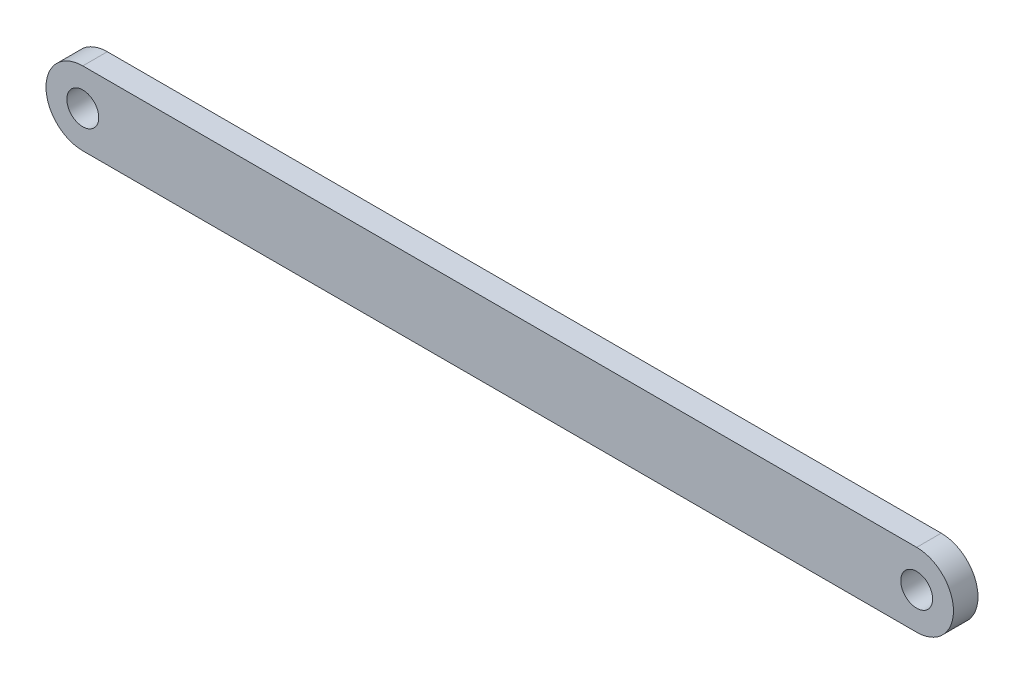
ISO-10303-21;
HEADER;
FILE_DESCRIPTION(('STEP AP214'),'2;1');
FILE_NAME('part.step','',(''),(''),'','','');
FILE_SCHEMA(('AUTOMOTIVE_DESIGN { 1 0 10303 214 1 1 1 1 }'));
ENDSEC;
DATA;
#1=APPLICATION_CONTEXT('core data for automotive mechanical design processes');
#2=APPLICATION_PROTOCOL_DEFINITION('international standard','automotive_design',2000,#1);
#3=PRODUCT_CONTEXT('',#1,'mechanical');
#4=PRODUCT('Part','Part','',(#3));
#5=PRODUCT_RELATED_PRODUCT_CATEGORY('part','',(#4));
#6=PRODUCT_DEFINITION_FORMATION('','',#4);
#7=PRODUCT_DEFINITION_CONTEXT('part definition',#1,'design');
#8=PRODUCT_DEFINITION('design','',#6,#7);
#9=PRODUCT_DEFINITION_SHAPE('','',#8);
#10=(LENGTH_UNIT() NAMED_UNIT(*) SI_UNIT(.MILLI.,.METRE.));
#11=(NAMED_UNIT(*) PLANE_ANGLE_UNIT() SI_UNIT($,.RADIAN.));
#12=(NAMED_UNIT(*) SI_UNIT($,.STERADIAN.) SOLID_ANGLE_UNIT());
#13=UNCERTAINTY_MEASURE_WITH_UNIT(LENGTH_MEASURE(1.E-05),#10,'distance_accuracy_value','');
#14=(GEOMETRIC_REPRESENTATION_CONTEXT(3) GLOBAL_UNCERTAINTY_ASSIGNED_CONTEXT((#13)) GLOBAL_UNIT_ASSIGNED_CONTEXT((#10,
#11,#12)) REPRESENTATION_CONTEXT('',''));
#15=CARTESIAN_POINT('',(0.,0.,0.));
#16=DIRECTION('',(0.,0.,1.));
#17=DIRECTION('',(1.,0.,0.));
#18=AXIS2_PLACEMENT_3D('',#15,#16,#17);
#19=CARTESIAN_POINT('',(0.,0.,2.5));
#20=DIRECTION('',(0.,0.,1.));
#21=DIRECTION('',(1.,0.,0.));
#22=AXIS2_PLACEMENT_3D('',#19,#20,#21);
#23=PLANE('',#22);
#24=CARTESIAN_POINT('',(0.,0.,2.5));
#25=DIRECTION('',(0.,0.,1.));
#26=DIRECTION('',(1.,0.,0.));
#27=AXIS2_PLACEMENT_3D('',#24,#25,#26);
#28=CIRCLE('',#27,3.25);
#29=CARTESIAN_POINT('',(3.25,0.,2.5));
#30=VERTEX_POINT('',#29);
#31=EDGE_CURVE('E102',#30,#30,#28,.T.);
#32=ORIENTED_EDGE('',*,*,#31,.F.);
#33=EDGE_LOOP('',(#32));
#34=FACE_BOUND('',#33,.T.);
#35=CARTESIAN_POINT('',(0.,0.,2.5));
#36=DIRECTION('',(0.,0.,1.));
#37=DIRECTION('',(1.,0.,0.));
#38=AXIS2_PLACEMENT_3D('',#35,#36,#37);
#39=CIRCLE('',#38,7.5);
#40=CARTESIAN_POINT('',(0.,7.5,2.5));
#41=VERTEX_POINT('',#40);
#42=CARTESIAN_POINT('',(0.,-7.5,2.5));
#43=VERTEX_POINT('',#42);
#44=EDGE_CURVE('E87',#41,#43,#39,.T.);
#45=ORIENTED_EDGE('',*,*,#44,.T.);
#46=DIRECTION('',(1.,0.,0.));
#47=VECTOR('',#46,1.);
#48=CARTESIAN_POINT('',(0.,-7.5,2.5));
#49=LINE('',#48,#47);
#50=CARTESIAN_POINT('',(170.,-7.5,2.5));
#51=VERTEX_POINT('',#50);
#52=EDGE_CURVE('E82',#43,#51,#49,.T.);
#53=ORIENTED_EDGE('',*,*,#52,.T.);
#54=CARTESIAN_POINT('',(170.,0.,2.5));
#55=DIRECTION('',(0.,0.,1.));
#56=DIRECTION('',(1.,0.,0.));
#57=AXIS2_PLACEMENT_3D('',#54,#55,#56);
#58=CIRCLE('',#57,7.5);
#59=CARTESIAN_POINT('',(170.,7.5,2.5));
#60=VERTEX_POINT('',#59);
#61=EDGE_CURVE('E85',#51,#60,#58,.T.);
#62=ORIENTED_EDGE('',*,*,#61,.T.);
#63=DIRECTION('',(-1.,0.,0.));
#64=VECTOR('',#63,1.);
#65=CARTESIAN_POINT('',(0.,7.5,2.5));
#66=LINE('',#65,#64);
#67=EDGE_CURVE('E52',#60,#41,#66,.T.);
#68=ORIENTED_EDGE('',*,*,#67,.T.);
#69=EDGE_LOOP('',(#45,#53,#62,#68));
#70=FACE_BOUND('',#69,.T.);
#71=CARTESIAN_POINT('',(170.,0.,2.5));
#72=DIRECTION('',(0.,0.,1.));
#73=DIRECTION('',(1.,0.,0.));
#74=AXIS2_PLACEMENT_3D('',#71,#72,#73);
#75=CIRCLE('',#74,3.25000000000001);
#76=CARTESIAN_POINT('',(173.25,0.,2.5));
#77=VERTEX_POINT('',#76);
#78=EDGE_CURVE('E117',#77,#77,#75,.T.);
#79=ORIENTED_EDGE('',*,*,#78,.F.);
#80=EDGE_LOOP('',(#79));
#81=FACE_BOUND('',#80,.T.);
#82=ADVANCED_FACE('F35',(#34,#70,#81),#23,.T.);
#83=CARTESIAN_POINT('',(0.,0.,-2.5));
#84=DIRECTION('',(0.,0.,1.));
#85=DIRECTION('',(1.,0.,0.));
#86=AXIS2_PLACEMENT_3D('',#83,#84,#85);
#87=PLANE('',#86);
#88=CARTESIAN_POINT('',(0.,0.,-2.5));
#89=DIRECTION('',(0.,0.,1.));
#90=DIRECTION('',(1.,0.,0.));
#91=AXIS2_PLACEMENT_3D('',#88,#89,#90);
#92=CIRCLE('',#91,3.25);
#93=CARTESIAN_POINT('',(3.25,0.,-2.5));
#94=VERTEX_POINT('',#93);
#95=EDGE_CURVE('E114',#94,#94,#92,.T.);
#96=ORIENTED_EDGE('',*,*,#95,.T.);
#97=EDGE_LOOP('',(#96));
#98=FACE_BOUND('',#97,.T.);
#99=CARTESIAN_POINT('',(0.,0.,-2.5));
#100=DIRECTION('',(0.,0.,1.));
#101=DIRECTION('',(1.,0.,0.));
#102=AXIS2_PLACEMENT_3D('',#99,#100,#101);
#103=CIRCLE('',#102,7.5);
#104=CARTESIAN_POINT('',(0.,7.5,-2.5));
#105=VERTEX_POINT('',#104);
#106=CARTESIAN_POINT('',(0.,-7.5,-2.5));
#107=VERTEX_POINT('',#106);
#108=EDGE_CURVE('E99',#105,#107,#103,.T.);
#109=ORIENTED_EDGE('',*,*,#108,.F.);
#110=DIRECTION('',(-1.,0.,0.));
#111=VECTOR('',#110,1.);
#112=CARTESIAN_POINT('',(0.,7.5,-2.5));
#113=LINE('',#112,#111);
#114=CARTESIAN_POINT('',(170.,7.5,-2.5));
#115=VERTEX_POINT('',#114);
#116=EDGE_CURVE('E75',#115,#105,#113,.T.);
#117=ORIENTED_EDGE('',*,*,#116,.F.);
#118=CARTESIAN_POINT('',(170.,0.,-2.5));
#119=DIRECTION('',(0.,0.,1.));
#120=DIRECTION('',(1.,0.,0.));
#121=AXIS2_PLACEMENT_3D('',#118,#119,#120);
#122=CIRCLE('',#121,7.5);
#123=CARTESIAN_POINT('',(170.,-7.5,-2.5));
#124=VERTEX_POINT('',#123);
#125=EDGE_CURVE('E69',#124,#115,#122,.T.);
#126=ORIENTED_EDGE('',*,*,#125,.F.);
#127=DIRECTION('',(1.,0.,0.));
#128=VECTOR('',#127,1.);
#129=CARTESIAN_POINT('',(0.,-7.5,-2.5));
#130=LINE('',#129,#128);
#131=EDGE_CURVE('E91',#107,#124,#130,.T.);
#132=ORIENTED_EDGE('',*,*,#131,.F.);
#133=EDGE_LOOP('',(#109,#117,#126,#132));
#134=FACE_BOUND('',#133,.T.);
#135=CARTESIAN_POINT('',(170.,0.,-2.5));
#136=DIRECTION('',(0.,0.,1.));
#137=DIRECTION('',(1.,0.,0.));
#138=AXIS2_PLACEMENT_3D('',#135,#136,#137);
#139=CIRCLE('',#138,3.25000000000001);
#140=CARTESIAN_POINT('',(173.25,0.,-2.5));
#141=VERTEX_POINT('',#140);
#142=EDGE_CURVE('E120',#141,#141,#139,.T.);
#143=ORIENTED_EDGE('',*,*,#142,.T.);
#144=EDGE_LOOP('',(#143));
#145=FACE_BOUND('',#144,.T.);
#146=ADVANCED_FACE('F110',(#98,#134,#145),#87,.F.);
#147=CARTESIAN_POINT('',(0.,0.,2.5));
#148=DIRECTION('',(0.,0.,-1.));
#149=DIRECTION('',(-1.,0.,0.));
#150=AXIS2_PLACEMENT_3D('',#147,#148,#149);
#151=CYLINDRICAL_SURFACE('',#150,7.5);
#152=ORIENTED_EDGE('',*,*,#108,.T.);
#153=DIRECTION('',(0.,0.,-1.));
#154=VECTOR('',#153,1.);
#155=CARTESIAN_POINT('',(0.,-7.5,2.5));
#156=LINE('',#155,#154);
#157=EDGE_CURVE('E11',#43,#107,#156,.T.);
#158=ORIENTED_EDGE('',*,*,#157,.F.);
#159=ORIENTED_EDGE('',*,*,#44,.F.);
#160=DIRECTION('',(0.,0.,-1.));
#161=VECTOR('',#160,1.);
#162=CARTESIAN_POINT('',(0.,7.5,2.5));
#163=LINE('',#162,#161);
#164=EDGE_CURVE('E95',#41,#105,#163,.T.);
#165=ORIENTED_EDGE('',*,*,#164,.T.);
#166=EDGE_LOOP('',(#152,#158,#159,#165));
#167=FACE_BOUND('',#166,.T.);
#168=ADVANCED_FACE('F37',(#167),#151,.T.);
#169=CARTESIAN_POINT('',(0.,-7.5,2.5));
#170=DIRECTION('',(0.,1.,0.));
#171=DIRECTION('',(0.,0.,1.));
#172=AXIS2_PLACEMENT_3D('',#169,#170,#171);
#173=PLANE('',#172);
#174=ORIENTED_EDGE('',*,*,#131,.T.);
#175=DIRECTION('',(0.,0.,-1.));
#176=VECTOR('',#175,1.);
#177=CARTESIAN_POINT('',(170.,-7.5,2.5));
#178=LINE('',#177,#176);
#179=EDGE_CURVE('E44',#51,#124,#178,.T.);
#180=ORIENTED_EDGE('',*,*,#179,.F.);
#181=ORIENTED_EDGE('',*,*,#52,.F.);
#182=ORIENTED_EDGE('',*,*,#157,.T.);
#183=EDGE_LOOP('',(#174,#180,#181,#182));
#184=FACE_BOUND('',#183,.T.);
#185=ADVANCED_FACE('F90',(#184),#173,.F.);
#186=CARTESIAN_POINT('',(170.,0.,2.5));
#187=DIRECTION('',(0.,0.,-1.));
#188=DIRECTION('',(-1.,0.,0.));
#189=AXIS2_PLACEMENT_3D('',#186,#187,#188);
#190=CYLINDRICAL_SURFACE('',#189,7.5);
#191=ORIENTED_EDGE('',*,*,#125,.T.);
#192=DIRECTION('',(0.,0.,-1.));
#193=VECTOR('',#192,1.);
#194=CARTESIAN_POINT('',(170.,7.5,2.5));
#195=LINE('',#194,#193);
#196=EDGE_CURVE('E92',#60,#115,#195,.T.);
#197=ORIENTED_EDGE('',*,*,#196,.F.);
#198=ORIENTED_EDGE('',*,*,#61,.F.);
#199=ORIENTED_EDGE('',*,*,#179,.T.);
#200=EDGE_LOOP('',(#191,#197,#198,#199));
#201=FACE_BOUND('',#200,.T.);
#202=ADVANCED_FACE('F93',(#201),#190,.T.);
#203=CARTESIAN_POINT('',(0.,7.5,2.5));
#204=DIRECTION('',(0.,-1.,0.));
#205=DIRECTION('',(0.,0.,-1.));
#206=AXIS2_PLACEMENT_3D('',#203,#204,#205);
#207=PLANE('',#206);
#208=ORIENTED_EDGE('',*,*,#116,.T.);
#209=ORIENTED_EDGE('',*,*,#164,.F.);
#210=ORIENTED_EDGE('',*,*,#67,.F.);
#211=ORIENTED_EDGE('',*,*,#196,.T.);
#212=EDGE_LOOP('',(#208,#209,#210,#211));
#213=FACE_BOUND('',#212,.T.);
#214=ADVANCED_FACE('F107',(#213),#207,.F.);
#215=CARTESIAN_POINT('',(0.,0.,2.5));
#216=DIRECTION('',(0.,0.,-1.));
#217=DIRECTION('',(-1.,0.,0.));
#218=AXIS2_PLACEMENT_3D('',#215,#216,#217);
#219=CYLINDRICAL_SURFACE('',#218,3.25);
#220=ORIENTED_EDGE('',*,*,#31,.T.);
#221=EDGE_LOOP('',(#220));
#222=FACE_BOUND('',#221,.T.);
#223=ORIENTED_EDGE('',*,*,#95,.F.);
#224=EDGE_LOOP('',(#223));
#225=FACE_BOUND('',#224,.T.);
#226=ADVANCED_FACE('F138',(#222,#225),#219,.F.);
#227=CARTESIAN_POINT('',(170.,0.,2.5));
#228=DIRECTION('',(0.,0.,-1.));
#229=DIRECTION('',(-1.,0.,0.));
#230=AXIS2_PLACEMENT_3D('',#227,#228,#229);
#231=CYLINDRICAL_SURFACE('',#230,3.25000000000001);
#232=ORIENTED_EDGE('',*,*,#78,.T.);
#233=EDGE_LOOP('',(#232));
#234=FACE_BOUND('',#233,.T.);
#235=ORIENTED_EDGE('',*,*,#142,.F.);
#236=EDGE_LOOP('',(#235));
#237=FACE_BOUND('',#236,.T.);
#238=ADVANCED_FACE('F126',(#234,#237),#231,.F.);
#239=CLOSED_SHELL('',(#82,#146,#168,#185,#202,#214,#226,#238));
#240=MANIFOLD_SOLID_BREP('B2',#239);
#241=ADVANCED_BREP_SHAPE_REPRESENTATION('',(#18,#240),#14);
#242=SHAPE_DEFINITION_REPRESENTATION(#9,#241);
ENDSEC;
END-ISO-10303-21;
